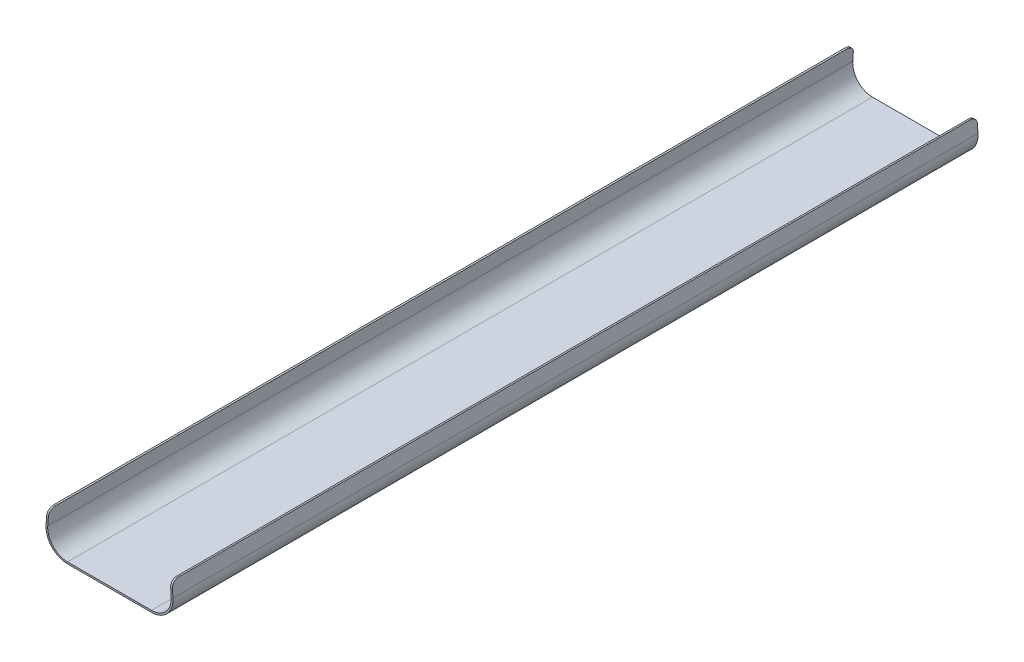
ISO-10303-21;
HEADER;
FILE_DESCRIPTION(('STEP AP214'),'2;1');
FILE_NAME('part.step','',(''),(''),'','','');
FILE_SCHEMA(('AUTOMOTIVE_DESIGN { 1 0 10303 214 1 1 1 1 }'));
ENDSEC;
DATA;
#1=APPLICATION_CONTEXT('core data for automotive mechanical design processes');
#2=APPLICATION_PROTOCOL_DEFINITION('international standard','automotive_design',2000,#1);
#3=PRODUCT_CONTEXT('',#1,'mechanical');
#4=PRODUCT('Part','Part','',(#3));
#5=PRODUCT_RELATED_PRODUCT_CATEGORY('part','',(#4));
#6=PRODUCT_DEFINITION_FORMATION('','',#4);
#7=PRODUCT_DEFINITION_CONTEXT('part definition',#1,'design');
#8=PRODUCT_DEFINITION('design','',#6,#7);
#9=PRODUCT_DEFINITION_SHAPE('','',#8);
#10=(LENGTH_UNIT() NAMED_UNIT(*) SI_UNIT(.MILLI.,.METRE.));
#11=(NAMED_UNIT(*) PLANE_ANGLE_UNIT() SI_UNIT($,.RADIAN.));
#12=(NAMED_UNIT(*) SI_UNIT($,.STERADIAN.) SOLID_ANGLE_UNIT());
#13=UNCERTAINTY_MEASURE_WITH_UNIT(LENGTH_MEASURE(1.E-05),#10,'distance_accuracy_value','');
#14=(GEOMETRIC_REPRESENTATION_CONTEXT(3) GLOBAL_UNCERTAINTY_ASSIGNED_CONTEXT((#13)) GLOBAL_UNIT_ASSIGNED_CONTEXT((#10,
#11,#12)) REPRESENTATION_CONTEXT('',''));
#15=CARTESIAN_POINT('',(0.,0.,0.));
#16=DIRECTION('',(0.,0.,1.));
#17=DIRECTION('',(1.,0.,0.));
#18=AXIS2_PLACEMENT_3D('',#15,#16,#17);
#19=CARTESIAN_POINT('',(452.110985161686,-185.701435369486,234.05));
#20=DIRECTION('',(0.997564050259824,-0.0697564737441253,0.));
#21=DIRECTION('',(0.0697564737441253,0.997564050259824,0.));
#22=AXIS2_PLACEMENT_3D('',#19,#20,#21);
#23=CYLINDRICAL_SURFACE('',#22,6.);
#24=DIRECTION('',(0.997564050259824,-0.0697564737441253,0.));
#25=VECTOR('',#24,1.);
#26=CARTESIAN_POINT('',(452.110985161686,-185.701435369487,240.05));
#27=LINE('',#26,#25);
#28=CARTESIAN_POINT('',(418.073776226517,-183.321321861195,240.05));
#29=VERTEX_POINT('',#28);
#30=CARTESIAN_POINT('',(419.669878706933,-183.432932219185,240.05));
#31=VERTEX_POINT('',#30);
#32=EDGE_CURVE('E234',#29,#31,#27,.T.);
#33=ORIENTED_EDGE('',*,*,#32,.T.);
#34=CARTESIAN_POINT('',(419.669878706933,-183.432932219185,234.05));
#35=DIRECTION('',(0.997564050259824,-0.0697564737441253,0.));
#36=DIRECTION('',(0.0697564737441253,0.997564050259824,0.));
#37=AXIS2_PLACEMENT_3D('',#34,#35,#36);
#38=CIRCLE('',#37,6.);
#39=CARTESIAN_POINT('',(420.088417549397,-177.447547917626,234.05));
#40=VERTEX_POINT('',#39);
#41=EDGE_CURVE('E200',#31,#40,#38,.F.);
#42=ORIENTED_EDGE('',*,*,#41,.T.);
#43=DIRECTION('',(-0.997564050259824,0.0697564737441253,0.));
#44=VECTOR('',#43,1.);
#45=CARTESIAN_POINT('',(420.088417549397,-177.447547917626,234.05));
#46=LINE('',#45,#44);
#47=CARTESIAN_POINT('',(418.492315068982,-177.335937559636,234.05));
#48=VERTEX_POINT('',#47);
#49=EDGE_CURVE('E227',#48,#40,#46,.F.);
#50=ORIENTED_EDGE('',*,*,#49,.F.);
#51=CARTESIAN_POINT('',(418.073776226517,-183.321321861195,234.05));
#52=DIRECTION('',(0.997564050259824,-0.0697564737441253,0.));
#53=DIRECTION('',(0.0697564737441253,0.997564050259824,0.));
#54=AXIS2_PLACEMENT_3D('',#51,#52,#53);
#55=CIRCLE('',#54,6.);
#56=EDGE_CURVE('E195',#29,#48,#55,.F.);
#57=ORIENTED_EDGE('',*,*,#56,.F.);
#58=EDGE_LOOP('',(#33,#42,#50,#57));
#59=FACE_BOUND('',#58,.T.);
#60=ADVANCED_FACE('F16',(#59),#23,.T.);
#61=CARTESIAN_POINT('',(420.088417549397,-177.447547917626,-510.95));
#62=DIRECTION('',(0.0697564737441253,0.997564050259824,0.));
#63=DIRECTION('',(-0.997564050259824,0.0697564737441253,0.));
#64=AXIS2_PLACEMENT_3D('',#61,#62,#63);
#65=PLANE('',#64);
#66=DIRECTION('',(0.997564050259824,-0.0697564737441253,0.));
#67=VECTOR('',#66,1.);
#68=CARTESIAN_POINT('',(452.529524004151,-179.716051067927,-501.95));
#69=LINE('',#68,#67);
#70=CARTESIAN_POINT('',(418.492315068982,-177.335937559636,-501.95));
#71=VERTEX_POINT('',#70);
#72=CARTESIAN_POINT('',(420.088417549397,-177.447547917626,-501.95));
#73=VERTEX_POINT('',#72);
#74=EDGE_CURVE('E139',#71,#73,#69,.T.);
#75=ORIENTED_EDGE('',*,*,#74,.F.);
#76=DIRECTION('',(0.,0.,1.));
#77=VECTOR('',#76,1.);
#78=CARTESIAN_POINT('',(418.492315068982,-177.335937559636,-133.95));
#79=LINE('',#78,#77);
#80=EDGE_CURVE('E190',#48,#71,#79,.F.);
#81=ORIENTED_EDGE('',*,*,#80,.F.);
#82=ORIENTED_EDGE('',*,*,#49,.T.);
#83=DIRECTION('',(0.,0.,1.));
#84=VECTOR('',#83,1.);
#85=CARTESIAN_POINT('',(420.088417549397,-177.447547917626,-133.95));
#86=LINE('',#85,#84);
#87=EDGE_CURVE('E196',#40,#73,#86,.F.);
#88=ORIENTED_EDGE('',*,*,#87,.T.);
#89=EDGE_LOOP('',(#75,#81,#82,#88));
#90=FACE_BOUND('',#89,.T.);
#91=ADVANCED_FACE('F502',(#90),#65,.T.);
#92=CARTESIAN_POINT('',(452.110985161686,-185.701435369486,-501.95));
#93=DIRECTION('',(0.997564050259824,-0.0697564737441253,0.));
#94=DIRECTION('',(0.0697564737441253,0.997564050259824,0.));
#95=AXIS2_PLACEMENT_3D('',#92,#93,#94);
#96=CYLINDRICAL_SURFACE('',#95,6.);
#97=ORIENTED_EDGE('',*,*,#74,.T.);
#98=CARTESIAN_POINT('',(419.669878706932,-183.432932219185,-501.95));
#99=DIRECTION('',(0.997564050259824,-0.0697564737441253,0.));
#100=DIRECTION('',(0.0697564737441253,0.997564050259824,0.));
#101=AXIS2_PLACEMENT_3D('',#98,#99,#100);
#102=CIRCLE('',#101,6.);
#103=CARTESIAN_POINT('',(419.669878706933,-183.432932219185,-507.95));
#104=VERTEX_POINT('',#103);
#105=EDGE_CURVE('E199',#73,#104,#102,.F.);
#106=ORIENTED_EDGE('',*,*,#105,.T.);
#107=DIRECTION('',(0.997564050259824,-0.0697564737441253,0.));
#108=VECTOR('',#107,1.);
#109=CARTESIAN_POINT('',(452.110985161686,-185.701435369486,-507.95));
#110=LINE('',#109,#108);
#111=CARTESIAN_POINT('',(418.073776226517,-183.321321861194,-507.95));
#112=VERTEX_POINT('',#111);
#113=EDGE_CURVE('E224',#104,#112,#110,.F.);
#114=ORIENTED_EDGE('',*,*,#113,.T.);
#115=CARTESIAN_POINT('',(418.073776226517,-183.321321861194,-501.95));
#116=DIRECTION('',(0.997564050259824,-0.0697564737441253,0.));
#117=DIRECTION('',(0.0697564737441253,0.997564050259824,0.));
#118=AXIS2_PLACEMENT_3D('',#115,#116,#117);
#119=CIRCLE('',#118,6.);
#120=EDGE_CURVE('E194',#71,#112,#119,.F.);
#121=ORIENTED_EDGE('',*,*,#120,.F.);
#122=EDGE_LOOP('',(#97,#106,#114,#121));
#123=FACE_BOUND('',#122,.T.);
#124=ADVANCED_FACE('F312',(#123),#96,.T.);
#125=CARTESIAN_POINT('',(452.110985161686,-189.113817252795,-501.95));
#126=DIRECTION('',(-0.997564050259824,-0.0697564737441253,0.));
#127=DIRECTION('',(0.0697564737441253,-0.997564050259824,0.));
#128=AXIS2_PLACEMENT_3D('',#125,#126,#127);
#129=CYLINDRICAL_SURFACE('',#128,6.);
#130=DIRECTION('',(-0.997564050259824,-0.0697564737441253,0.));
#131=VECTOR('',#130,1.);
#132=CARTESIAN_POINT('',(452.110985161686,-189.113817252795,-507.95));
#133=LINE('',#132,#131);
#134=CARTESIAN_POINT('',(534.947528550506,-183.321321861195,-507.95));
#135=VERTEX_POINT('',#134);
#136=CARTESIAN_POINT('',(533.351426070091,-183.432932219185,-507.95));
#137=VERTEX_POINT('',#136);
#138=EDGE_CURVE('E127',#135,#137,#133,.T.);
#139=ORIENTED_EDGE('',*,*,#138,.T.);
#140=CARTESIAN_POINT('',(533.351426070091,-183.432932219185,-501.95));
#141=DIRECTION('',(-0.997564050259824,-0.0697564737441253,0.));
#142=DIRECTION('',(0.0697564737441253,-0.997564050259824,0.));
#143=AXIS2_PLACEMENT_3D('',#140,#141,#142);
#144=CIRCLE('',#143,6.);
#145=CARTESIAN_POINT('',(532.932887227626,-177.447547917626,-501.95));
#146=VERTEX_POINT('',#145);
#147=EDGE_CURVE('E19',#137,#146,#144,.F.);
#148=ORIENTED_EDGE('',*,*,#147,.T.);
#149=DIRECTION('',(-0.997564050259824,-0.0697564737441253,0.));
#150=VECTOR('',#149,1.);
#151=CARTESIAN_POINT('',(532.932887227626,-177.447547917626,-501.95));
#152=LINE('',#151,#150);
#153=CARTESIAN_POINT('',(534.528989708042,-177.335937559636,-501.95));
#154=VERTEX_POINT('',#153);
#155=EDGE_CURVE('E138',#154,#146,#152,.T.);
#156=ORIENTED_EDGE('',*,*,#155,.F.);
#157=CARTESIAN_POINT('',(534.947528550507,-183.321321861194,-501.95));
#158=DIRECTION('',(-0.997564050259824,-0.0697564737441253,0.));
#159=DIRECTION('',(0.0697564737441253,-0.997564050259824,0.));
#160=AXIS2_PLACEMENT_3D('',#157,#158,#159);
#161=CIRCLE('',#160,6.);
#162=EDGE_CURVE('E132',#135,#154,#161,.F.);
#163=ORIENTED_EDGE('',*,*,#162,.F.);
#164=EDGE_LOOP('',(#139,#148,#156,#163));
#165=FACE_BOUND('',#164,.T.);
#166=ADVANCED_FACE('F129',(#165),#129,.T.);
#167=CARTESIAN_POINT('',(532.932887227626,-177.447547917626,243.05));
#168=DIRECTION('',(-0.0697564737441253,0.997564050259824,0.));
#169=DIRECTION('',(-0.997564050259824,-0.0697564737441253,0.));
#170=AXIS2_PLACEMENT_3D('',#167,#168,#169);
#171=PLANE('',#170);
#172=DIRECTION('',(-0.997564050259824,-0.0697564737441253,0.));
#173=VECTOR('',#172,1.);
#174=CARTESIAN_POINT('',(451.692446319221,-183.128432951236,234.05));
#175=LINE('',#174,#173);
#176=CARTESIAN_POINT('',(534.528989708041,-177.335937559636,234.05));
#177=VERTEX_POINT('',#176);
#178=CARTESIAN_POINT('',(532.932887227626,-177.447547917626,234.05));
#179=VERTEX_POINT('',#178);
#180=EDGE_CURVE('E151',#177,#179,#175,.T.);
#181=ORIENTED_EDGE('',*,*,#180,.F.);
#182=DIRECTION('',(0.,0.,1.));
#183=VECTOR('',#182,1.);
#184=CARTESIAN_POINT('',(534.528989708041,-177.335937559636,-133.95));
#185=LINE('',#184,#183);
#186=EDGE_CURVE('E178',#154,#177,#185,.T.);
#187=ORIENTED_EDGE('',*,*,#186,.F.);
#188=ORIENTED_EDGE('',*,*,#155,.T.);
#189=DIRECTION('',(0.,0.,1.));
#190=VECTOR('',#189,1.);
#191=CARTESIAN_POINT('',(532.932887227626,-177.447547917626,-133.95));
#192=LINE('',#191,#190);
#193=EDGE_CURVE('E149',#146,#179,#192,.T.);
#194=ORIENTED_EDGE('',*,*,#193,.T.);
#195=EDGE_LOOP('',(#181,#187,#188,#194));
#196=FACE_BOUND('',#195,.T.);
#197=ADVANCED_FACE('F347',(#196),#171,.T.);
#198=CARTESIAN_POINT('',(452.110985161686,-189.113817252795,234.05));
#199=DIRECTION('',(-0.997564050259824,-0.0697564737441253,0.));
#200=DIRECTION('',(0.0697564737441253,-0.997564050259824,0.));
#201=AXIS2_PLACEMENT_3D('',#198,#199,#200);
#202=CYLINDRICAL_SURFACE('',#201,6.);
#203=ORIENTED_EDGE('',*,*,#180,.T.);
#204=CARTESIAN_POINT('',(533.351426070091,-183.432932219185,234.05));
#205=DIRECTION('',(-0.997564050259824,-0.0697564737441253,0.));
#206=DIRECTION('',(0.0697564737441253,-0.997564050259824,0.));
#207=AXIS2_PLACEMENT_3D('',#204,#205,#206);
#208=CIRCLE('',#207,6.);
#209=CARTESIAN_POINT('',(533.351426070091,-183.432932219185,240.05));
#210=VERTEX_POINT('',#209);
#211=EDGE_CURVE('E213',#179,#210,#208,.F.);
#212=ORIENTED_EDGE('',*,*,#211,.T.);
#213=DIRECTION('',(-0.997564050259824,-0.0697564737441253,0.));
#214=VECTOR('',#213,1.);
#215=CARTESIAN_POINT('',(452.110985161686,-189.113817252795,240.05));
#216=LINE('',#215,#214);
#217=CARTESIAN_POINT('',(534.947528550506,-183.321321861194,240.05));
#218=VERTEX_POINT('',#217);
#219=EDGE_CURVE('E216',#210,#218,#216,.F.);
#220=ORIENTED_EDGE('',*,*,#219,.T.);
#221=CARTESIAN_POINT('',(534.947528550506,-183.321321861195,234.05));
#222=DIRECTION('',(-0.997564050259824,-0.0697564737441253,0.));
#223=DIRECTION('',(0.0697564737441253,-0.997564050259824,0.));
#224=AXIS2_PLACEMENT_3D('',#221,#222,#223);
#225=CIRCLE('',#224,6.);
#226=EDGE_CURVE('E182',#177,#218,#225,.F.);
#227=ORIENTED_EDGE('',*,*,#226,.F.);
#228=EDGE_LOOP('',(#203,#212,#220,#227));
#229=FACE_BOUND('',#228,.T.);
#230=ADVANCED_FACE('F282',(#229),#202,.T.);
#231=CARTESIAN_POINT('',(541.151051633401,-294.972774327403,-133.95));
#232=DIRECTION('',(0.997564050259824,0.0697564737441253,0.));
#233=DIRECTION('',(-0.0697564737441253,0.997564050259824,0.));
#234=AXIS2_PLACEMENT_3D('',#231,#232,#233);
#235=PLANE('',#234);
#236=DIRECTION('',(0.0697564737440897,-0.997564050259827,0.));
#237=VECTOR('',#236,1.);
#238=CARTESIAN_POINT('',(533.351426070091,-183.432932219185,240.05));
#239=LINE('',#238,#237);
#240=CARTESIAN_POINT('',(533.880955302983,-191.005553051951,240.05));
#241=VERTEX_POINT('',#240);
#242=EDGE_CURVE('E255',#210,#241,#239,.T.);
#243=ORIENTED_EDGE('',*,*,#242,.F.);
#244=ORIENTED_EDGE('',*,*,#211,.F.);
#245=ORIENTED_EDGE('',*,*,#193,.F.);
#246=ORIENTED_EDGE('',*,*,#147,.F.);
#247=DIRECTION('',(-0.0697564737440897,0.997564050259827,0.));
#248=VECTOR('',#247,1.);
#249=CARTESIAN_POINT('',(533.880955302983,-191.005553051951,-507.95));
#250=LINE('',#249,#248);
#251=CARTESIAN_POINT('',(533.880955302983,-191.005553051951,-507.95));
#252=VERTEX_POINT('',#251);
#253=EDGE_CURVE('E146',#252,#137,#250,.T.);
#254=ORIENTED_EDGE('',*,*,#253,.F.);
#255=DIRECTION('',(0.,0.,-1.));
#256=VECTOR('',#255,1.);
#257=CARTESIAN_POINT('',(533.880955302983,-191.005553051951,-133.95));
#258=LINE('',#257,#256);
#259=EDGE_CURVE('E210',#252,#241,#258,.F.);
#260=ORIENTED_EDGE('',*,*,#259,.T.);
#261=EDGE_LOOP('',(#243,#244,#245,#246,#254,#260));
#262=FACE_BOUND('',#261,.T.);
#263=ADVANCED_FACE('F145',(#262),#235,.F.);
#264=CARTESIAN_POINT('',(515.525776778202,-192.289072168843,-133.95));
#265=DIRECTION('',(0.,0.,-1.));
#266=DIRECTION('',(-1.,0.,0.));
#267=AXIS2_PLACEMENT_3D('',#264,#265,#266);
#268=CYLINDRICAL_SURFACE('',#267,18.4);
#269=CARTESIAN_POINT('',(515.525776778202,-192.289072168843,-507.95));
#270=DIRECTION('',(0.,0.,-1.));
#271=DIRECTION('',(-1.,0.,0.));
#272=AXIS2_PLACEMENT_3D('',#269,#270,#271);
#273=CIRCLE('',#272,18.4);
#274=CARTESIAN_POINT('',(515.525776778202,-210.689072168843,-507.95));
#275=VERTEX_POINT('',#274);
#276=EDGE_CURVE('E156',#275,#252,#273,.F.);
#277=ORIENTED_EDGE('',*,*,#276,.F.);
#278=DIRECTION('',(0.,0.,-1.));
#279=VECTOR('',#278,1.);
#280=CARTESIAN_POINT('',(515.525776778202,-210.689072168843,-133.95));
#281=LINE('',#280,#279);
#282=CARTESIAN_POINT('',(515.525776778202,-210.689072168843,240.05));
#283=VERTEX_POINT('',#282);
#284=EDGE_CURVE('E207',#275,#283,#281,.F.);
#285=ORIENTED_EDGE('',*,*,#284,.T.);
#286=CARTESIAN_POINT('',(515.525776778202,-192.289072168843,240.05));
#287=DIRECTION('',(0.,0.,-1.));
#288=DIRECTION('',(-1.,0.,0.));
#289=AXIS2_PLACEMENT_3D('',#286,#287,#288);
#290=CIRCLE('',#289,18.4);
#291=EDGE_CURVE('E251',#241,#283,#290,.T.);
#292=ORIENTED_EDGE('',*,*,#291,.F.);
#293=ORIENTED_EDGE('',*,*,#259,.F.);
#294=EDGE_LOOP('',(#277,#285,#292,#293));
#295=FACE_BOUND('',#294,.T.);
#296=ADVANCED_FACE('F329',(#295),#268,.F.);
#297=CARTESIAN_POINT('',(447.804380484607,-210.689072168843,-133.95));
#298=DIRECTION('',(0.,-1.,0.));
#299=DIRECTION('',(0.,0.,-1.));
#300=AXIS2_PLACEMENT_3D('',#297,#298,#299);
#301=PLANE('',#300);
#302=DIRECTION('',(1.,0.,0.));
#303=VECTOR('',#302,1.);
#304=CARTESIAN_POINT('',(550.030341904479,-210.689072168843,240.05));
#305=LINE('',#304,#303);
#306=CARTESIAN_POINT('',(437.495527998821,-210.689072168843,240.05));
#307=VERTEX_POINT('',#306);
#308=EDGE_CURVE('E250',#283,#307,#305,.F.);
#309=ORIENTED_EDGE('',*,*,#308,.F.);
#310=ORIENTED_EDGE('',*,*,#284,.F.);
#311=DIRECTION('',(-1.,0.,0.));
#312=VECTOR('',#311,1.);
#313=CARTESIAN_POINT('',(542.79405339825,-210.689072168843,-507.95));
#314=LINE('',#313,#312);
#315=CARTESIAN_POINT('',(437.495527998821,-210.689072168843,-507.95));
#316=VERTEX_POINT('',#315);
#317=EDGE_CURVE('E166',#316,#275,#314,.F.);
#318=ORIENTED_EDGE('',*,*,#317,.F.);
#319=DIRECTION('',(0.,0.,-1.));
#320=VECTOR('',#319,1.);
#321=CARTESIAN_POINT('',(437.495527998821,-210.689072168843,-133.95));
#322=LINE('',#321,#320);
#323=EDGE_CURVE('E204',#316,#307,#322,.F.);
#324=ORIENTED_EDGE('',*,*,#323,.T.);
#325=EDGE_LOOP('',(#309,#310,#318,#324));
#326=FACE_BOUND('',#325,.T.);
#327=ADVANCED_FACE('F327',(#326),#301,.F.);
#328=CARTESIAN_POINT('',(437.495527998821,-192.289072168843,-133.95));
#329=DIRECTION('',(0.,0.,-1.));
#330=DIRECTION('',(-1.,0.,0.));
#331=AXIS2_PLACEMENT_3D('',#328,#329,#330);
#332=CYLINDRICAL_SURFACE('',#331,18.4);
#333=CARTESIAN_POINT('',(437.495527998821,-192.289072168843,-507.95));
#334=DIRECTION('',(0.,0.,-1.));
#335=DIRECTION('',(-1.,0.,0.));
#336=AXIS2_PLACEMENT_3D('',#333,#334,#335);
#337=CIRCLE('',#336,18.4);
#338=CARTESIAN_POINT('',(419.14034947404,-191.00555305195,-507.95));
#339=VERTEX_POINT('',#338);
#340=EDGE_CURVE('E172',#339,#316,#337,.F.);
#341=ORIENTED_EDGE('',*,*,#340,.F.);
#342=DIRECTION('',(0.,0.,1.));
#343=VECTOR('',#342,1.);
#344=CARTESIAN_POINT('',(419.14034947404,-191.005553051951,-133.95));
#345=LINE('',#344,#343);
#346=CARTESIAN_POINT('',(419.14034947404,-191.00555305195,240.05));
#347=VERTEX_POINT('',#346);
#348=EDGE_CURVE('E201',#339,#347,#345,.T.);
#349=ORIENTED_EDGE('',*,*,#348,.T.);
#350=CARTESIAN_POINT('',(437.495527998821,-192.289072168843,240.05));
#351=DIRECTION('',(0.,0.,-1.));
#352=DIRECTION('',(-1.,0.,0.));
#353=AXIS2_PLACEMENT_3D('',#350,#351,#352);
#354=CIRCLE('',#353,18.4);
#355=EDGE_CURVE('E245',#307,#347,#354,.T.);
#356=ORIENTED_EDGE('',*,*,#355,.F.);
#357=ORIENTED_EDGE('',*,*,#323,.F.);
#358=EDGE_LOOP('',(#341,#349,#356,#357));
#359=FACE_BOUND('',#358,.T.);
#360=ADVANCED_FACE('F322',(#359),#332,.F.);
#361=CARTESIAN_POINT('',(415.875149748335,-237.700084590764,-133.95));
#362=DIRECTION('',(-0.997564050259824,0.0697564737441253,0.));
#363=DIRECTION('',(-0.0697564737441253,-0.997564050259824,0.));
#364=AXIS2_PLACEMENT_3D('',#361,#362,#363);
#365=PLANE('',#364);
#366=DIRECTION('',(-0.0697564737442061,-0.997564050259819,0.));
#367=VECTOR('',#366,1.);
#368=CARTESIAN_POINT('',(419.669878706933,-183.432932219185,-507.95));
#369=LINE('',#368,#367);
#370=EDGE_CURVE('E173',#104,#339,#369,.T.);
#371=ORIENTED_EDGE('',*,*,#370,.F.);
#372=ORIENTED_EDGE('',*,*,#105,.F.);
#373=ORIENTED_EDGE('',*,*,#87,.F.);
#374=ORIENTED_EDGE('',*,*,#41,.F.);
#375=DIRECTION('',(0.0697564737442061,0.997564050259819,0.));
#376=VECTOR('',#375,1.);
#377=CARTESIAN_POINT('',(419.14034947404,-191.005553051951,240.05));
#378=LINE('',#377,#376);
#379=EDGE_CURVE('E249',#347,#31,#378,.T.);
#380=ORIENTED_EDGE('',*,*,#379,.F.);
#381=ORIENTED_EDGE('',*,*,#348,.F.);
#382=EDGE_LOOP('',(#371,#372,#373,#374,#380,#381));
#383=FACE_BOUND('',#382,.T.);
#384=ADVANCED_FACE('F317',(#383),#365,.F.);
#385=CARTESIAN_POINT('',(414.27904726792,-237.588474232773,-133.95));
#386=DIRECTION('',(-0.997564050259824,0.0697564737441253,0.));
#387=DIRECTION('',(-0.0697564737441253,-0.997564050259824,0.));
#388=AXIS2_PLACEMENT_3D('',#385,#386,#387);
#389=PLANE('',#388);
#390=ORIENTED_EDGE('',*,*,#120,.T.);
#391=DIRECTION('',(0.0697564737440846,0.997564050259827,0.));
#392=VECTOR('',#391,1.);
#393=CARTESIAN_POINT('',(417.544246993625,-190.89394269396,-507.95));
#394=LINE('',#393,#392);
#395=CARTESIAN_POINT('',(417.544246993625,-190.893942693961,-507.95));
#396=VERTEX_POINT('',#395);
#397=EDGE_CURVE('E187',#396,#112,#394,.T.);
#398=ORIENTED_EDGE('',*,*,#397,.F.);
#399=DIRECTION('',(0.,0.,-1.));
#400=VECTOR('',#399,1.);
#401=CARTESIAN_POINT('',(417.544246993625,-190.89394269396,-133.95));
#402=LINE('',#401,#400);
#403=CARTESIAN_POINT('',(417.544246993625,-190.893942693961,240.05));
#404=VERTEX_POINT('',#403);
#405=EDGE_CURVE('E177',#404,#396,#402,.T.);
#406=ORIENTED_EDGE('',*,*,#405,.F.);
#407=DIRECTION('',(-0.0697564737440846,-0.997564050259827,0.));
#408=VECTOR('',#407,1.);
#409=CARTESIAN_POINT('',(418.073776226517,-183.321321861195,240.05));
#410=LINE('',#409,#408);
#411=EDGE_CURVE('E244',#29,#404,#410,.T.);
#412=ORIENTED_EDGE('',*,*,#411,.F.);
#413=ORIENTED_EDGE('',*,*,#56,.T.);
#414=ORIENTED_EDGE('',*,*,#80,.T.);
#415=EDGE_LOOP('',(#390,#398,#406,#412,#413,#414));
#416=FACE_BOUND('',#415,.T.);
#417=ADVANCED_FACE('F306',(#416),#389,.T.);
#418=CARTESIAN_POINT('',(542.747154113816,-294.861163969412,-133.95));
#419=DIRECTION('',(0.997564050259824,0.0697564737441253,0.));
#420=DIRECTION('',(-0.0697564737441253,0.997564050259824,0.));
#421=AXIS2_PLACEMENT_3D('',#418,#419,#420);
#422=PLANE('',#421);
#423=ORIENTED_EDGE('',*,*,#226,.T.);
#424=DIRECTION('',(-0.0697564737442155,0.997564050259818,0.));
#425=VECTOR('',#424,1.);
#426=CARTESIAN_POINT('',(535.477057783399,-190.89394269396,240.05));
#427=LINE('',#426,#425);
#428=CARTESIAN_POINT('',(535.477057783399,-190.893942693959,240.05));
#429=VERTEX_POINT('',#428);
#430=EDGE_CURVE('E239',#429,#218,#427,.T.);
#431=ORIENTED_EDGE('',*,*,#430,.F.);
#432=DIRECTION('',(0.,0.,-1.));
#433=VECTOR('',#432,1.);
#434=CARTESIAN_POINT('',(535.477057783399,-190.89394269396,-133.95));
#435=LINE('',#434,#433);
#436=CARTESIAN_POINT('',(535.477057783399,-190.893942693959,-507.95));
#437=VERTEX_POINT('',#436);
#438=EDGE_CURVE('E183',#437,#429,#435,.F.);
#439=ORIENTED_EDGE('',*,*,#438,.F.);
#440=DIRECTION('',(0.0697564737442155,-0.997564050259818,0.));
#441=VECTOR('',#440,1.);
#442=CARTESIAN_POINT('',(534.947528550506,-183.321321861195,-507.95));
#443=LINE('',#442,#441);
#444=EDGE_CURVE('E158',#135,#437,#443,.T.);
#445=ORIENTED_EDGE('',*,*,#444,.F.);
#446=ORIENTED_EDGE('',*,*,#162,.T.);
#447=ORIENTED_EDGE('',*,*,#186,.T.);
#448=EDGE_LOOP('',(#423,#431,#439,#445,#446,#447));
#449=FACE_BOUND('',#448,.T.);
#450=ADVANCED_FACE('F344',(#449),#422,.T.);
#451=CARTESIAN_POINT('',(437.495527998821,-192.289072168843,-133.95));
#452=DIRECTION('',(0.,0.,-1.));
#453=DIRECTION('',(-1.,0.,0.));
#454=AXIS2_PLACEMENT_3D('',#451,#452,#453);
#455=CYLINDRICAL_SURFACE('',#454,20.);
#456=ORIENTED_EDGE('',*,*,#405,.T.);
#457=CARTESIAN_POINT('',(437.495527998821,-192.289072168843,-507.95));
#458=DIRECTION('',(0.,0.,-1.));
#459=DIRECTION('',(-1.,0.,0.));
#460=AXIS2_PLACEMENT_3D('',#457,#458,#459);
#461=CIRCLE('',#460,20.);
#462=CARTESIAN_POINT('',(437.495527998821,-212.289072168843,-507.95));
#463=VERTEX_POINT('',#462);
#464=EDGE_CURVE('E163',#463,#396,#461,.T.);
#465=ORIENTED_EDGE('',*,*,#464,.F.);
#466=DIRECTION('',(0.,0.,-1.));
#467=VECTOR('',#466,1.);
#468=CARTESIAN_POINT('',(437.495527998821,-212.289072168843,-133.95));
#469=LINE('',#468,#467);
#470=CARTESIAN_POINT('',(437.495527998821,-212.289072168843,240.05));
#471=VERTEX_POINT('',#470);
#472=EDGE_CURVE('E295',#471,#463,#469,.T.);
#473=ORIENTED_EDGE('',*,*,#472,.F.);
#474=CARTESIAN_POINT('',(437.495527998821,-192.289072168843,240.05));
#475=DIRECTION('',(0.,0.,-1.));
#476=DIRECTION('',(-1.,0.,0.));
#477=AXIS2_PLACEMENT_3D('',#474,#475,#476);
#478=CIRCLE('',#477,20.);
#479=EDGE_CURVE('E240',#404,#471,#478,.F.);
#480=ORIENTED_EDGE('',*,*,#479,.F.);
#481=EDGE_LOOP('',(#456,#465,#473,#480));
#482=FACE_BOUND('',#481,.T.);
#483=ADVANCED_FACE('F369',(#482),#455,.T.);
#484=CARTESIAN_POINT('',(542.79405339825,-224.028523700214,-507.95));
#485=DIRECTION('',(0.,0.,-1.));
#486=DIRECTION('',(-1.,0.,0.));
#487=AXIS2_PLACEMENT_3D('',#484,#485,#486);
#488=PLANE('',#487);
#489=ORIENTED_EDGE('',*,*,#464,.T.);
#490=ORIENTED_EDGE('',*,*,#397,.T.);
#491=ORIENTED_EDGE('',*,*,#113,.F.);
#492=ORIENTED_EDGE('',*,*,#370,.T.);
#493=ORIENTED_EDGE('',*,*,#340,.T.);
#494=ORIENTED_EDGE('',*,*,#317,.T.);
#495=ORIENTED_EDGE('',*,*,#276,.T.);
#496=ORIENTED_EDGE('',*,*,#253,.T.);
#497=ORIENTED_EDGE('',*,*,#138,.F.);
#498=ORIENTED_EDGE('',*,*,#444,.T.);
#499=CARTESIAN_POINT('',(515.525776778202,-192.289072168843,-507.95));
#500=DIRECTION('',(0.,0.,-1.));
#501=DIRECTION('',(-1.,0.,0.));
#502=AXIS2_PLACEMENT_3D('',#499,#500,#501);
#503=CIRCLE('',#502,20.);
#504=CARTESIAN_POINT('',(515.525776778202,-212.289072168843,-507.95));
#505=VERTEX_POINT('',#504);
#506=EDGE_CURVE('E186',#505,#437,#503,.F.);
#507=ORIENTED_EDGE('',*,*,#506,.F.);
#508=DIRECTION('',(1.,0.,0.));
#509=VECTOR('',#508,1.);
#510=CARTESIAN_POINT('',(447.804380484607,-212.289072168843,-507.95));
#511=LINE('',#510,#509);
#512=EDGE_CURVE('E293',#463,#505,#511,.T.);
#513=ORIENTED_EDGE('',*,*,#512,.F.);
#514=EDGE_LOOP('',(#489,#490,#491,#492,#493,#494,#495,#496,#497,#498,#507,#513));
#515=FACE_BOUND('',#514,.T.);
#516=ADVANCED_FACE('F153',(#515),#488,.T.);
#517=CARTESIAN_POINT('',(515.525776778202,-192.289072168843,-133.95));
#518=DIRECTION('',(0.,0.,-1.));
#519=DIRECTION('',(-1.,0.,0.));
#520=AXIS2_PLACEMENT_3D('',#517,#518,#519);
#521=CYLINDRICAL_SURFACE('',#520,20.);
#522=DIRECTION('',(0.,0.,-1.));
#523=VECTOR('',#522,1.);
#524=CARTESIAN_POINT('',(515.525776778202,-212.289072168843,-133.95));
#525=LINE('',#524,#523);
#526=CARTESIAN_POINT('',(515.525776778202,-212.289072168843,240.05));
#527=VERTEX_POINT('',#526);
#528=EDGE_CURVE('E26',#505,#527,#525,.F.);
#529=ORIENTED_EDGE('',*,*,#528,.F.);
#530=ORIENTED_EDGE('',*,*,#506,.T.);
#531=ORIENTED_EDGE('',*,*,#438,.T.);
#532=CARTESIAN_POINT('',(515.525776778202,-192.289072168843,240.05));
#533=DIRECTION('',(0.,0.,-1.));
#534=DIRECTION('',(-1.,0.,0.));
#535=AXIS2_PLACEMENT_3D('',#532,#533,#534);
#536=CIRCLE('',#535,20.);
#537=EDGE_CURVE('E35',#527,#429,#536,.F.);
#538=ORIENTED_EDGE('',*,*,#537,.F.);
#539=EDGE_LOOP('',(#529,#530,#531,#538));
#540=FACE_BOUND('',#539,.T.);
#541=ADVANCED_FACE('F362',(#540),#521,.T.);
#542=CARTESIAN_POINT('',(550.030341904479,-400.5015417055,240.05));
#543=DIRECTION('',(0.,0.,1.));
#544=DIRECTION('',(1.,0.,0.));
#545=AXIS2_PLACEMENT_3D('',#542,#543,#544);
#546=PLANE('',#545);
#547=ORIENTED_EDGE('',*,*,#537,.T.);
#548=ORIENTED_EDGE('',*,*,#430,.T.);
#549=ORIENTED_EDGE('',*,*,#219,.F.);
#550=ORIENTED_EDGE('',*,*,#242,.T.);
#551=ORIENTED_EDGE('',*,*,#291,.T.);
#552=ORIENTED_EDGE('',*,*,#308,.T.);
#553=ORIENTED_EDGE('',*,*,#355,.T.);
#554=ORIENTED_EDGE('',*,*,#379,.T.);
#555=ORIENTED_EDGE('',*,*,#32,.F.);
#556=ORIENTED_EDGE('',*,*,#411,.T.);
#557=ORIENTED_EDGE('',*,*,#479,.T.);
#558=DIRECTION('',(1.,0.,0.));
#559=VECTOR('',#558,1.);
#560=CARTESIAN_POINT('',(447.804380484607,-212.289072168843,240.05));
#561=LINE('',#560,#559);
#562=EDGE_CURVE('E11',#527,#471,#561,.F.);
#563=ORIENTED_EDGE('',*,*,#562,.F.);
#564=EDGE_LOOP('',(#547,#548,#549,#550,#551,#552,#553,#554,#555,#556,#557,#563));
#565=FACE_BOUND('',#564,.T.);
#566=ADVANCED_FACE('F330',(#565),#546,.T.);
#567=CARTESIAN_POINT('',(447.804380484607,-212.289072168843,-133.95));
#568=DIRECTION('',(0.,-1.,0.));
#569=DIRECTION('',(0.,0.,-1.));
#570=AXIS2_PLACEMENT_3D('',#567,#568,#569);
#571=PLANE('',#570);
#572=ORIENTED_EDGE('',*,*,#528,.T.);
#573=ORIENTED_EDGE('',*,*,#562,.T.);
#574=ORIENTED_EDGE('',*,*,#472,.T.);
#575=ORIENTED_EDGE('',*,*,#512,.T.);
#576=EDGE_LOOP('',(#572,#573,#574,#575));
#577=FACE_BOUND('',#576,.T.);
#578=ADVANCED_FACE('F356',(#577),#571,.T.);
#579=CLOSED_SHELL('',(#60,#91,#124,#166,#197,#230,#263,#296,#327,#360,#384,#417,#450,#483,#516,
#541,#566,#578));
#580=MANIFOLD_SOLID_BREP('B1',#579);
#581=ADVANCED_BREP_SHAPE_REPRESENTATION('',(#18,#580),#14);
#582=SHAPE_DEFINITION_REPRESENTATION(#9,#581);
ENDSEC;
END-ISO-10303-21;
